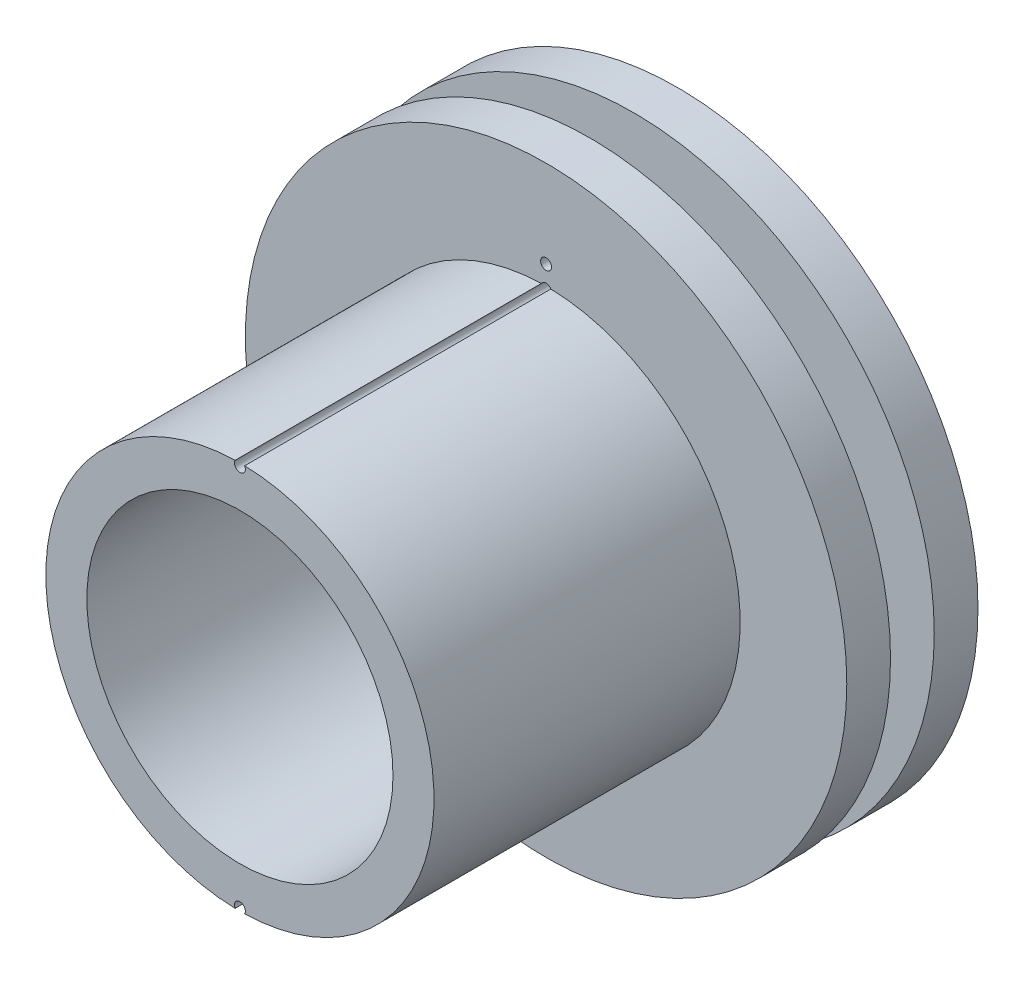
ISO-10303-21;
HEADER;
FILE_DESCRIPTION(('STEP AP214'),'2;1');
FILE_NAME('part.step','',(''),(''),'','','');
FILE_SCHEMA(('AUTOMOTIVE_DESIGN { 1 0 10303 214 1 1 1 1 }'));
ENDSEC;
DATA;
#1=APPLICATION_CONTEXT('core data for automotive mechanical design processes');
#2=APPLICATION_PROTOCOL_DEFINITION('international standard','automotive_design',2000,#1);
#3=PRODUCT_CONTEXT('',#1,'mechanical');
#4=PRODUCT('Part','Part','',(#3));
#5=PRODUCT_RELATED_PRODUCT_CATEGORY('part','',(#4));
#6=PRODUCT_DEFINITION_FORMATION('','',#4);
#7=PRODUCT_DEFINITION_CONTEXT('part definition',#1,'design');
#8=PRODUCT_DEFINITION('design','',#6,#7);
#9=PRODUCT_DEFINITION_SHAPE('','',#8);
#10=(LENGTH_UNIT() NAMED_UNIT(*) SI_UNIT(.MILLI.,.METRE.));
#11=(NAMED_UNIT(*) PLANE_ANGLE_UNIT() SI_UNIT($,.RADIAN.));
#12=(NAMED_UNIT(*) SI_UNIT($,.STERADIAN.) SOLID_ANGLE_UNIT());
#13=UNCERTAINTY_MEASURE_WITH_UNIT(LENGTH_MEASURE(1.E-05),#10,'distance_accuracy_value','');
#14=(GEOMETRIC_REPRESENTATION_CONTEXT(3) GLOBAL_UNCERTAINTY_ASSIGNED_CONTEXT((#13)) GLOBAL_UNIT_ASSIGNED_CONTEXT((#10,
#11,#12)) REPRESENTATION_CONTEXT('',''));
#15=CARTESIAN_POINT('',(0.,0.,0.));
#16=DIRECTION('',(0.,0.,1.));
#17=DIRECTION('',(1.,0.,0.));
#18=AXIS2_PLACEMENT_3D('',#15,#16,#17);
#19=CARTESIAN_POINT('',(0.,0.,6.));
#20=DIRECTION('',(0.,0.,1.));
#21=DIRECTION('',(1.,0.,0.));
#22=AXIS2_PLACEMENT_3D('',#19,#20,#21);
#23=PLANE('',#22);
#24=CARTESIAN_POINT('',(0.,9.75,6.));
#25=DIRECTION('',(0.,0.,1.));
#26=DIRECTION('',(1.,0.,0.));
#27=AXIS2_PLACEMENT_3D('',#24,#25,#26);
#28=CIRCLE('',#27,0.25);
#29=CARTESIAN_POINT('',(0.25,9.75,6.));
#30=VERTEX_POINT('',#29);
#31=EDGE_CURVE('E150',#30,#30,#28,.F.);
#32=ORIENTED_EDGE('',*,*,#31,.T.);
#33=EDGE_LOOP('',(#32));
#34=FACE_BOUND('',#33,.T.);
#35=CARTESIAN_POINT('',(0.,0.,6.));
#36=DIRECTION('',(0.,0.,1.));
#37=DIRECTION('',(1.,0.,0.));
#38=AXIS2_PLACEMENT_3D('',#35,#36,#37);
#39=CIRCLE('',#38,13.75);
#40=CARTESIAN_POINT('',(13.75,0.,6.));
#41=VERTEX_POINT('',#40);
#42=EDGE_CURVE('E107',#41,#41,#39,.T.);
#43=ORIENTED_EDGE('',*,*,#42,.T.);
#44=EDGE_LOOP('',(#43));
#45=FACE_BOUND('',#44,.T.);
#46=CARTESIAN_POINT('',(0.,-9.75,6.));
#47=DIRECTION('',(0.,0.,1.));
#48=DIRECTION('',(1.,0.,0.));
#49=AXIS2_PLACEMENT_3D('',#46,#47,#48);
#50=CIRCLE('',#49,0.25);
#51=CARTESIAN_POINT('',(0.25,-9.75,6.));
#52=VERTEX_POINT('',#51);
#53=EDGE_CURVE('E140',#52,#52,#50,.F.);
#54=ORIENTED_EDGE('',*,*,#53,.T.);
#55=EDGE_LOOP('',(#54));
#56=FACE_BOUND('',#55,.T.);
#57=CARTESIAN_POINT('',(0.,0.,6.));
#58=DIRECTION('',(0.,0.,1.));
#59=DIRECTION('',(1.,0.,0.));
#60=AXIS2_PLACEMENT_3D('',#57,#58,#59);
#61=CIRCLE('',#60,8.875);
#62=CARTESIAN_POINT('',(0.218030887977479,-8.87232142857143,6.));
#63=VERTEX_POINT('',#62);
#64=CARTESIAN_POINT('',(0.218030887977508,8.87232142857143,6.));
#65=VERTEX_POINT('',#64);
#66=EDGE_CURVE('E105',#63,#65,#61,.T.);
#67=ORIENTED_EDGE('',*,*,#66,.F.);
#68=CARTESIAN_POINT('',(0.,-8.75,6.));
#69=DIRECTION('',(0.,0.,1.));
#70=DIRECTION('',(1.,0.,0.));
#71=AXIS2_PLACEMENT_3D('',#68,#69,#70);
#72=CIRCLE('',#71,0.25);
#73=CARTESIAN_POINT('',(-0.218030887977508,-8.87232142857143,6.));
#74=VERTEX_POINT('',#73);
#75=EDGE_CURVE('E47',#63,#74,#72,.F.);
#76=ORIENTED_EDGE('',*,*,#75,.T.);
#77=CARTESIAN_POINT('',(-0.21803088797748,8.87232142857143,6.));
#78=VERTEX_POINT('',#77);
#79=EDGE_CURVE('E90',#78,#74,#61,.T.);
#80=ORIENTED_EDGE('',*,*,#79,.F.);
#81=CARTESIAN_POINT('',(0.,8.75,6.));
#82=DIRECTION('',(0.,0.,1.));
#83=DIRECTION('',(1.,0.,0.));
#84=AXIS2_PLACEMENT_3D('',#81,#82,#83);
#85=CIRCLE('',#84,0.25);
#86=EDGE_CURVE('E133',#78,#65,#85,.F.);
#87=ORIENTED_EDGE('',*,*,#86,.T.);
#88=EDGE_LOOP('',(#67,#76,#80,#87));
#89=FACE_BOUND('',#88,.T.);
#90=ADVANCED_FACE('F33',(#34,#45,#56,#89),#23,.T.);
#91=CARTESIAN_POINT('',(0.,0.,4.));
#92=DIRECTION('',(0.,0.,1.));
#93=DIRECTION('',(1.,0.,0.));
#94=AXIS2_PLACEMENT_3D('',#91,#92,#93);
#95=PLANE('',#94);
#96=CARTESIAN_POINT('',(0.,9.75,4.));
#97=DIRECTION('',(0.,0.,1.));
#98=DIRECTION('',(1.,0.,0.));
#99=AXIS2_PLACEMENT_3D('',#96,#97,#98);
#100=CIRCLE('',#99,0.25);
#101=CARTESIAN_POINT('',(0.25,9.75,4.));
#102=VERTEX_POINT('',#101);
#103=EDGE_CURVE('E148',#102,#102,#100,.T.);
#104=ORIENTED_EDGE('',*,*,#103,.T.);
#105=EDGE_LOOP('',(#104));
#106=FACE_BOUND('',#105,.T.);
#107=CARTESIAN_POINT('',(0.,0.,4.));
#108=DIRECTION('',(0.,0.,1.));
#109=DIRECTION('',(1.,0.,0.));
#110=AXIS2_PLACEMENT_3D('',#107,#108,#109);
#111=CIRCLE('',#110,13.75);
#112=CARTESIAN_POINT('',(13.75,0.,4.));
#113=VERTEX_POINT('',#112);
#114=EDGE_CURVE('E99',#113,#113,#111,.T.);
#115=ORIENTED_EDGE('',*,*,#114,.F.);
#116=EDGE_LOOP('',(#115));
#117=FACE_BOUND('',#116,.T.);
#118=CARTESIAN_POINT('',(0.,-9.75,4.));
#119=DIRECTION('',(0.,0.,1.));
#120=DIRECTION('',(1.,0.,0.));
#121=AXIS2_PLACEMENT_3D('',#118,#119,#120);
#122=CIRCLE('',#121,0.25);
#123=CARTESIAN_POINT('',(0.25,-9.75,4.));
#124=VERTEX_POINT('',#123);
#125=EDGE_CURVE('E137',#124,#124,#122,.T.);
#126=ORIENTED_EDGE('',*,*,#125,.T.);
#127=EDGE_LOOP('',(#126));
#128=FACE_BOUND('',#127,.T.);
#129=CARTESIAN_POINT('',(0.,0.,4.));
#130=DIRECTION('',(0.,0.,1.));
#131=DIRECTION('',(1.,0.,0.));
#132=AXIS2_PLACEMENT_3D('',#129,#130,#131);
#133=CIRCLE('',#132,8.5);
#134=CARTESIAN_POINT('',(0.,8.5,4.));
#135=VERTEX_POINT('',#134);
#136=CARTESIAN_POINT('',(0.,-8.5,4.));
#137=VERTEX_POINT('',#136);
#138=EDGE_CURVE('E122',#135,#137,#133,.T.);
#139=ORIENTED_EDGE('',*,*,#138,.T.);
#140=CARTESIAN_POINT('',(0.,-8.75,4.));
#141=DIRECTION('',(0.,0.,1.));
#142=DIRECTION('',(1.,0.,0.));
#143=AXIS2_PLACEMENT_3D('',#140,#141,#142);
#144=CIRCLE('',#143,0.25);
#145=EDGE_CURVE('E53',#137,#137,#144,.T.);
#146=ORIENTED_EDGE('',*,*,#145,.T.);
#147=EDGE_CURVE('E119',#137,#135,#133,.T.);
#148=ORIENTED_EDGE('',*,*,#147,.T.);
#149=CARTESIAN_POINT('',(0.,8.75,4.));
#150=DIRECTION('',(0.,0.,1.));
#151=DIRECTION('',(1.,0.,0.));
#152=AXIS2_PLACEMENT_3D('',#149,#150,#151);
#153=CIRCLE('',#152,0.25);
#154=EDGE_CURVE('E142',#135,#135,#153,.T.);
#155=ORIENTED_EDGE('',*,*,#154,.T.);
#156=EDGE_LOOP('',(#139,#146,#148,#155));
#157=FACE_BOUND('',#156,.T.);
#158=ADVANCED_FACE('F170',(#106,#117,#128,#157),#95,.F.);
#159=CARTESIAN_POINT('',(0.,0.,20.));
#160=DIRECTION('',(0.,0.,1.));
#161=DIRECTION('',(1.,0.,0.));
#162=AXIS2_PLACEMENT_3D('',#159,#160,#161);
#163=PLANE('',#162);
#164=CARTESIAN_POINT('',(0.,0.,20.));
#165=DIRECTION('',(0.,0.,1.));
#166=DIRECTION('',(1.,0.,0.));
#167=AXIS2_PLACEMENT_3D('',#164,#165,#166);
#168=CIRCLE('',#167,7.);
#169=CARTESIAN_POINT('',(7.,0.,20.));
#170=VERTEX_POINT('',#169);
#171=EDGE_CURVE('E103',#170,#170,#168,.T.);
#172=ORIENTED_EDGE('',*,*,#171,.F.);
#173=EDGE_LOOP('',(#172));
#174=FACE_BOUND('',#173,.T.);
#175=CARTESIAN_POINT('',(0.,0.,20.));
#176=DIRECTION('',(0.,0.,1.));
#177=DIRECTION('',(1.,0.,0.));
#178=AXIS2_PLACEMENT_3D('',#175,#176,#177);
#179=CIRCLE('',#178,8.875);
#180=CARTESIAN_POINT('',(-0.218030887977472,8.87232142857143,20.));
#181=VERTEX_POINT('',#180);
#182=CARTESIAN_POINT('',(-0.218030887977472,-8.87232142857143,20.));
#183=VERTEX_POINT('',#182);
#184=EDGE_CURVE('E88',#181,#183,#179,.T.);
#185=ORIENTED_EDGE('',*,*,#184,.T.);
#186=CARTESIAN_POINT('',(0.,-8.75,20.));
#187=DIRECTION('',(0.,0.,1.));
#188=DIRECTION('',(1.,0.,0.));
#189=AXIS2_PLACEMENT_3D('',#186,#187,#188);
#190=CIRCLE('',#189,0.25);
#191=CARTESIAN_POINT('',(0.218030887977472,-8.87232142857143,20.));
#192=VERTEX_POINT('',#191);
#193=EDGE_CURVE('E76',#192,#183,#190,.T.);
#194=ORIENTED_EDGE('',*,*,#193,.F.);
#195=CARTESIAN_POINT('',(0.218030887977472,8.87232142857143,20.));
#196=VERTEX_POINT('',#195);
#197=EDGE_CURVE('E96',#192,#196,#179,.T.);
#198=ORIENTED_EDGE('',*,*,#197,.T.);
#199=CARTESIAN_POINT('',(0.,8.75,20.));
#200=DIRECTION('',(0.,0.,1.));
#201=DIRECTION('',(1.,0.,0.));
#202=AXIS2_PLACEMENT_3D('',#199,#200,#201);
#203=CIRCLE('',#202,0.25);
#204=EDGE_CURVE('E94',#181,#196,#203,.T.);
#205=ORIENTED_EDGE('',*,*,#204,.F.);
#206=EDGE_LOOP('',(#185,#194,#198,#205));
#207=FACE_BOUND('',#206,.T.);
#208=ADVANCED_FACE('F92',(#174,#207),#163,.T.);
#209=CARTESIAN_POINT('',(0.,0.,20.));
#210=DIRECTION('',(0.,0.,-1.));
#211=DIRECTION('',(-1.,0.,0.));
#212=AXIS2_PLACEMENT_3D('',#209,#210,#211);
#213=CYLINDRICAL_SURFACE('',#212,8.875);
#214=DIRECTION('',(0.,0.,-1.));
#215=VECTOR('',#214,1.);
#216=CARTESIAN_POINT('',(-0.218030887977481,-8.87232142857141,12.));
#217=LINE('',#216,#215);
#218=EDGE_CURVE('E11',#183,#74,#217,.T.);
#219=ORIENTED_EDGE('',*,*,#218,.F.);
#220=ORIENTED_EDGE('',*,*,#184,.F.);
#221=DIRECTION('',(0.,0.,-1.));
#222=VECTOR('',#221,1.);
#223=CARTESIAN_POINT('',(-0.218030887977481,8.87232142857141,12.));
#224=LINE('',#223,#222);
#225=EDGE_CURVE('E125',#78,#181,#224,.F.);
#226=ORIENTED_EDGE('',*,*,#225,.F.);
#227=ORIENTED_EDGE('',*,*,#79,.T.);
#228=EDGE_LOOP('',(#219,#220,#226,#227));
#229=FACE_BOUND('',#228,.T.);
#230=ADVANCED_FACE('F86',(#229),#213,.T.);
#231=DIRECTION('',(0.,0.,-1.));
#232=VECTOR('',#231,1.);
#233=CARTESIAN_POINT('',(0.218030887977481,-8.87232142857141,12.));
#234=LINE('',#233,#232);
#235=EDGE_CURVE('E41',#63,#192,#234,.F.);
#236=ORIENTED_EDGE('',*,*,#235,.F.);
#237=ORIENTED_EDGE('',*,*,#66,.T.);
#238=DIRECTION('',(0.,0.,-1.));
#239=VECTOR('',#238,1.);
#240=CARTESIAN_POINT('',(0.218030887977481,8.87232142857141,12.));
#241=LINE('',#240,#239);
#242=EDGE_CURVE('E127',#196,#65,#241,.T.);
#243=ORIENTED_EDGE('',*,*,#242,.F.);
#244=ORIENTED_EDGE('',*,*,#197,.F.);
#245=EDGE_LOOP('',(#236,#237,#243,#244));
#246=FACE_BOUND('',#245,.T.);
#247=ADVANCED_FACE('F157',(#246),#213,.T.);
#248=CARTESIAN_POINT('',(0.,0.,0.));
#249=DIRECTION('',(0.,0.,1.));
#250=DIRECTION('',(1.,0.,0.));
#251=AXIS2_PLACEMENT_3D('',#248,#249,#250);
#252=PLANE('',#251);
#253=CARTESIAN_POINT('',(0.,0.,0.));
#254=DIRECTION('',(0.,0.,1.));
#255=DIRECTION('',(1.,0.,0.));
#256=AXIS2_PLACEMENT_3D('',#253,#254,#255);
#257=CIRCLE('',#256,13.75);
#258=CARTESIAN_POINT('',(13.75,0.,0.));
#259=VERTEX_POINT('',#258);
#260=EDGE_CURVE('E115',#259,#259,#257,.T.);
#261=ORIENTED_EDGE('',*,*,#260,.F.);
#262=EDGE_LOOP('',(#261));
#263=FACE_BOUND('',#262,.T.);
#264=CARTESIAN_POINT('',(0.,0.,0.));
#265=DIRECTION('',(0.,0.,1.));
#266=DIRECTION('',(1.,0.,0.));
#267=AXIS2_PLACEMENT_3D('',#264,#265,#266);
#268=CIRCLE('',#267,7.);
#269=CARTESIAN_POINT('',(7.,0.,0.));
#270=VERTEX_POINT('',#269);
#271=EDGE_CURVE('E95',#270,#270,#268,.T.);
#272=ORIENTED_EDGE('',*,*,#271,.T.);
#273=EDGE_LOOP('',(#272));
#274=FACE_BOUND('',#273,.T.);
#275=ADVANCED_FACE('F159',(#263,#274),#252,.F.);
#276=CARTESIAN_POINT('',(0.,0.,6.));
#277=DIRECTION('',(0.,0.,-1.));
#278=DIRECTION('',(-1.,0.,0.));
#279=AXIS2_PLACEMENT_3D('',#276,#277,#278);
#280=CYLINDRICAL_SURFACE('',#279,8.5);
#281=CARTESIAN_POINT('',(0.,0.,2.));
#282=DIRECTION('',(0.,0.,1.));
#283=DIRECTION('',(1.,0.,0.));
#284=AXIS2_PLACEMENT_3D('',#281,#282,#283);
#285=CIRCLE('',#284,8.5);
#286=CARTESIAN_POINT('',(8.5,0.,2.));
#287=VERTEX_POINT('',#286);
#288=EDGE_CURVE('E110',#287,#287,#285,.F.);
#289=ORIENTED_EDGE('',*,*,#288,.F.);
#290=EDGE_LOOP('',(#289));
#291=FACE_BOUND('',#290,.T.);
#292=ORIENTED_EDGE('',*,*,#138,.F.);
#293=ORIENTED_EDGE('',*,*,#147,.F.);
#294=EDGE_LOOP('',(#292,#293));
#295=FACE_BOUND('',#294,.T.);
#296=ADVANCED_FACE('F165',(#291,#295),#280,.T.);
#297=CARTESIAN_POINT('',(0.,0.,2.));
#298=DIRECTION('',(0.,0.,1.));
#299=DIRECTION('',(1.,0.,0.));
#300=AXIS2_PLACEMENT_3D('',#297,#298,#299);
#301=PLANE('',#300);
#302=CARTESIAN_POINT('',(0.,0.,2.));
#303=DIRECTION('',(0.,0.,1.));
#304=DIRECTION('',(1.,0.,0.));
#305=AXIS2_PLACEMENT_3D('',#302,#303,#304);
#306=CIRCLE('',#305,13.75);
#307=CARTESIAN_POINT('',(13.75,0.,2.));
#308=VERTEX_POINT('',#307);
#309=EDGE_CURVE('E116',#308,#308,#306,.T.);
#310=ORIENTED_EDGE('',*,*,#309,.T.);
#311=EDGE_LOOP('',(#310));
#312=FACE_BOUND('',#311,.T.);
#313=ORIENTED_EDGE('',*,*,#288,.T.);
#314=EDGE_LOOP('',(#313));
#315=FACE_BOUND('',#314,.T.);
#316=ADVANCED_FACE('F183',(#312,#315),#301,.T.);
#317=CARTESIAN_POINT('',(0.,0.,2.));
#318=DIRECTION('',(0.,0.,-1.));
#319=DIRECTION('',(-1.,0.,0.));
#320=AXIS2_PLACEMENT_3D('',#317,#318,#319);
#321=CYLINDRICAL_SURFACE('',#320,13.75);
#322=ORIENTED_EDGE('',*,*,#309,.F.);
#323=EDGE_LOOP('',(#322));
#324=FACE_BOUND('',#323,.T.);
#325=ORIENTED_EDGE('',*,*,#260,.T.);
#326=EDGE_LOOP('',(#325));
#327=FACE_BOUND('',#326,.T.);
#328=ADVANCED_FACE('F35',(#324,#327),#321,.T.);
#329=CARTESIAN_POINT('',(0.,0.,6.));
#330=DIRECTION('',(0.,0.,-1.));
#331=DIRECTION('',(-1.,0.,0.));
#332=AXIS2_PLACEMENT_3D('',#329,#330,#331);
#333=CYLINDRICAL_SURFACE('',#332,13.75);
#334=ORIENTED_EDGE('',*,*,#42,.F.);
#335=EDGE_LOOP('',(#334));
#336=FACE_BOUND('',#335,.T.);
#337=ORIENTED_EDGE('',*,*,#114,.T.);
#338=EDGE_LOOP('',(#337));
#339=FACE_BOUND('',#338,.T.);
#340=ADVANCED_FACE('F180',(#336,#339),#333,.T.);
#341=CARTESIAN_POINT('',(0.,0.,6.));
#342=DIRECTION('',(0.,0.,-1.));
#343=DIRECTION('',(-1.,0.,0.));
#344=AXIS2_PLACEMENT_3D('',#341,#342,#343);
#345=CYLINDRICAL_SURFACE('',#344,7.);
#346=ORIENTED_EDGE('',*,*,#271,.F.);
#347=EDGE_LOOP('',(#346));
#348=FACE_BOUND('',#347,.T.);
#349=ORIENTED_EDGE('',*,*,#171,.T.);
#350=EDGE_LOOP('',(#349));
#351=FACE_BOUND('',#350,.T.);
#352=ADVANCED_FACE('F216',(#348,#351),#345,.F.);
#353=CARTESIAN_POINT('',(0.,9.75,20.));
#354=DIRECTION('',(0.,0.,-1.));
#355=DIRECTION('',(-1.,0.,0.));
#356=AXIS2_PLACEMENT_3D('',#353,#354,#355);
#357=CYLINDRICAL_SURFACE('',#356,0.25);
#358=ORIENTED_EDGE('',*,*,#31,.F.);
#359=EDGE_LOOP('',(#358));
#360=FACE_BOUND('',#359,.T.);
#361=ORIENTED_EDGE('',*,*,#103,.F.);
#362=EDGE_LOOP('',(#361));
#363=FACE_BOUND('',#362,.T.);
#364=ADVANCED_FACE('F211',(#360,#363),#357,.F.);
#365=CARTESIAN_POINT('',(0.,-9.75,20.));
#366=DIRECTION('',(0.,0.,-1.));
#367=DIRECTION('',(-1.,0.,0.));
#368=AXIS2_PLACEMENT_3D('',#365,#366,#367);
#369=CYLINDRICAL_SURFACE('',#368,0.25);
#370=ORIENTED_EDGE('',*,*,#53,.F.);
#371=EDGE_LOOP('',(#370));
#372=FACE_BOUND('',#371,.T.);
#373=ORIENTED_EDGE('',*,*,#125,.F.);
#374=EDGE_LOOP('',(#373));
#375=FACE_BOUND('',#374,.T.);
#376=ADVANCED_FACE('F204',(#372,#375),#369,.F.);
#377=CARTESIAN_POINT('',(0.,8.75,20.));
#378=DIRECTION('',(0.,0.,-1.));
#379=DIRECTION('',(-1.,0.,0.));
#380=AXIS2_PLACEMENT_3D('',#377,#378,#379);
#381=CYLINDRICAL_SURFACE('',#380,0.25);
#382=ORIENTED_EDGE('',*,*,#154,.F.);
#383=EDGE_LOOP('',(#382));
#384=FACE_BOUND('',#383,.T.);
#385=ORIENTED_EDGE('',*,*,#242,.T.);
#386=ORIENTED_EDGE('',*,*,#86,.F.);
#387=ORIENTED_EDGE('',*,*,#225,.T.);
#388=ORIENTED_EDGE('',*,*,#204,.T.);
#389=EDGE_LOOP('',(#385,#386,#387,#388));
#390=FACE_BOUND('',#389,.T.);
#391=ADVANCED_FACE('F132',(#384,#390),#381,.F.);
#392=CARTESIAN_POINT('',(0.,-8.75,20.));
#393=DIRECTION('',(0.,0.,-1.));
#394=DIRECTION('',(-1.,0.,0.));
#395=AXIS2_PLACEMENT_3D('',#392,#393,#394);
#396=CYLINDRICAL_SURFACE('',#395,0.25);
#397=ORIENTED_EDGE('',*,*,#145,.F.);
#398=EDGE_LOOP('',(#397));
#399=FACE_BOUND('',#398,.T.);
#400=ORIENTED_EDGE('',*,*,#218,.T.);
#401=ORIENTED_EDGE('',*,*,#75,.F.);
#402=ORIENTED_EDGE('',*,*,#235,.T.);
#403=ORIENTED_EDGE('',*,*,#193,.T.);
#404=EDGE_LOOP('',(#400,#401,#402,#403));
#405=FACE_BOUND('',#404,.T.);
#406=ADVANCED_FACE('F78',(#399,#405),#396,.F.);
#407=CLOSED_SHELL('',(#90,#158,#208,#230,#247,#275,#296,#316,#328,#340,#352,#364,#376,#391,#406));
#408=MANIFOLD_SOLID_BREP('B2',#407);
#409=ADVANCED_BREP_SHAPE_REPRESENTATION('',(#18,#408),#14);
#410=SHAPE_DEFINITION_REPRESENTATION(#9,#409);
ENDSEC;
END-ISO-10303-21;
